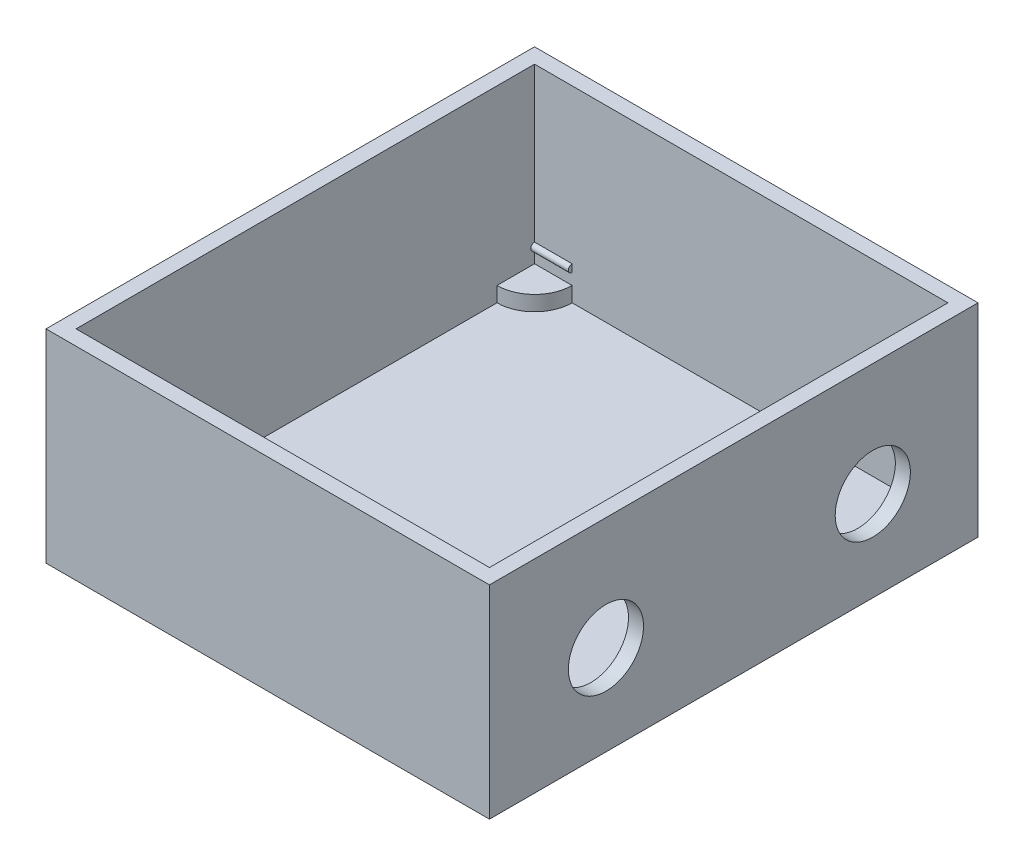
ISO-10303-21;
HEADER;
FILE_DESCRIPTION(('STEP AP214'),'2;1');
FILE_NAME('part.step','',(''),(''),'','','');
FILE_SCHEMA(('AUTOMOTIVE_DESIGN { 1 0 10303 214 1 1 1 1 }'));
ENDSEC;
DATA;
#1=APPLICATION_CONTEXT('core data for automotive mechanical design processes');
#2=APPLICATION_PROTOCOL_DEFINITION('international standard','automotive_design',2000,#1);
#3=PRODUCT_CONTEXT('',#1,'mechanical');
#4=PRODUCT('Part','Part','',(#3));
#5=PRODUCT_RELATED_PRODUCT_CATEGORY('part','',(#4));
#6=PRODUCT_DEFINITION_FORMATION('','',#4);
#7=PRODUCT_DEFINITION_CONTEXT('part definition',#1,'design');
#8=PRODUCT_DEFINITION('design','',#6,#7);
#9=PRODUCT_DEFINITION_SHAPE('','',#8);
#10=(LENGTH_UNIT() NAMED_UNIT(*) SI_UNIT(.MILLI.,.METRE.));
#11=(NAMED_UNIT(*) PLANE_ANGLE_UNIT() SI_UNIT($,.RADIAN.));
#12=(NAMED_UNIT(*) SI_UNIT($,.STERADIAN.) SOLID_ANGLE_UNIT());
#13=UNCERTAINTY_MEASURE_WITH_UNIT(LENGTH_MEASURE(1.E-05),#10,'distance_accuracy_value','');
#14=(GEOMETRIC_REPRESENTATION_CONTEXT(3) GLOBAL_UNCERTAINTY_ASSIGNED_CONTEXT((#13)) GLOBAL_UNIT_ASSIGNED_CONTEXT((#10,
#11,#12)) REPRESENTATION_CONTEXT('',''));
#15=CARTESIAN_POINT('',(0.,0.,0.));
#16=DIRECTION('',(0.,0.,1.));
#17=DIRECTION('',(1.,0.,0.));
#18=AXIS2_PLACEMENT_3D('',#15,#16,#17);
#19=CARTESIAN_POINT('',(-27.5,25.,-30.5));
#20=DIRECTION('',(0.,0.,1.));
#21=DIRECTION('',(1.,0.,0.));
#22=AXIS2_PLACEMENT_3D('',#19,#20,#21);
#23=PLANE('',#22);
#24=DIRECTION('',(0.,-1.,0.));
#25=VECTOR('',#24,1.);
#26=CARTESIAN_POINT('',(27.5,25.,-30.5));
#27=LINE('',#26,#25);
#28=CARTESIAN_POINT('',(27.5,3.5,-30.5));
#29=VERTEX_POINT('',#28);
#30=CARTESIAN_POINT('',(27.5,2.,-30.5));
#31=VERTEX_POINT('',#30);
#32=EDGE_CURVE('E206',#29,#31,#27,.T.);
#33=ORIENTED_EDGE('',*,*,#32,.F.);
#34=DIRECTION('',(1.,0.,0.));
#35=VECTOR('',#34,1.);
#36=CARTESIAN_POINT('',(27.5,3.5,-30.5));
#37=LINE('',#36,#35);
#38=CARTESIAN_POINT('',(22.5,3.5,-30.5));
#39=VERTEX_POINT('',#38);
#40=EDGE_CURVE('E48',#39,#29,#37,.T.);
#41=ORIENTED_EDGE('',*,*,#40,.F.);
#42=DIRECTION('',(0.,1.,0.));
#43=VECTOR('',#42,1.);
#44=CARTESIAN_POINT('',(22.5,4.,-30.5));
#45=LINE('',#44,#43);
#46=CARTESIAN_POINT('',(22.5,4.5,-30.5));
#47=VERTEX_POINT('',#46);
#48=EDGE_CURVE('E193',#39,#47,#45,.T.);
#49=ORIENTED_EDGE('',*,*,#48,.T.);
#50=DIRECTION('',(1.,0.,0.));
#51=VECTOR('',#50,1.);
#52=CARTESIAN_POINT('',(27.5,4.5,-30.5));
#53=LINE('',#52,#51);
#54=CARTESIAN_POINT('',(27.5,4.5,-30.5));
#55=VERTEX_POINT('',#54);
#56=EDGE_CURVE('E199',#47,#55,#53,.T.);
#57=ORIENTED_EDGE('',*,*,#56,.T.);
#58=CARTESIAN_POINT('',(27.5,25.,-30.5));
#59=VERTEX_POINT('',#58);
#60=EDGE_CURVE('E359',#59,#55,#27,.T.);
#61=ORIENTED_EDGE('',*,*,#60,.F.);
#62=DIRECTION('',(-1.,0.,0.));
#63=VECTOR('',#62,1.);
#64=CARTESIAN_POINT('',(-27.5,25.,-30.5));
#65=LINE('',#64,#63);
#66=CARTESIAN_POINT('',(-27.5,25.,-30.5));
#67=VERTEX_POINT('',#66);
#68=EDGE_CURVE('E339',#59,#67,#65,.T.);
#69=ORIENTED_EDGE('',*,*,#68,.T.);
#70=DIRECTION('',(0.,-1.,0.));
#71=VECTOR('',#70,1.);
#72=CARTESIAN_POINT('',(-27.5,25.,-30.5));
#73=LINE('',#72,#71);
#74=CARTESIAN_POINT('',(-27.5,4.5,-30.5));
#75=VERTEX_POINT('',#74);
#76=EDGE_CURVE('E356',#67,#75,#73,.T.);
#77=ORIENTED_EDGE('',*,*,#76,.T.);
#78=DIRECTION('',(1.,0.,0.));
#79=VECTOR('',#78,1.);
#80=CARTESIAN_POINT('',(-27.5,4.5,-30.5));
#81=LINE('',#80,#79);
#82=CARTESIAN_POINT('',(-22.5,4.5,-30.5));
#83=VERTEX_POINT('',#82);
#84=EDGE_CURVE('E212',#75,#83,#81,.T.);
#85=ORIENTED_EDGE('',*,*,#84,.T.);
#86=DIRECTION('',(0.,-1.,0.));
#87=VECTOR('',#86,1.);
#88=CARTESIAN_POINT('',(-22.5,4.,-30.5));
#89=LINE('',#88,#87);
#90=CARTESIAN_POINT('',(-22.5,3.5,-30.5));
#91=VERTEX_POINT('',#90);
#92=EDGE_CURVE('E215',#83,#91,#89,.T.);
#93=ORIENTED_EDGE('',*,*,#92,.T.);
#94=DIRECTION('',(1.,0.,0.));
#95=VECTOR('',#94,1.);
#96=CARTESIAN_POINT('',(-27.5,3.5,-30.5));
#97=LINE('',#96,#95);
#98=CARTESIAN_POINT('',(-27.5,3.5,-30.5));
#99=VERTEX_POINT('',#98);
#100=EDGE_CURVE('E56',#99,#91,#97,.T.);
#101=ORIENTED_EDGE('',*,*,#100,.F.);
#102=CARTESIAN_POINT('',(-27.5,2.,-30.5));
#103=VERTEX_POINT('',#102);
#104=EDGE_CURVE('E355',#99,#103,#73,.T.);
#105=ORIENTED_EDGE('',*,*,#104,.T.);
#106=DIRECTION('',(-1.,0.,0.));
#107=VECTOR('',#106,1.);
#108=CARTESIAN_POINT('',(-27.5,2.,-30.5));
#109=LINE('',#108,#107);
#110=CARTESIAN_POINT('',(-22.5,2.,-30.5));
#111=VERTEX_POINT('',#110);
#112=EDGE_CURVE('E307',#111,#103,#109,.T.);
#113=ORIENTED_EDGE('',*,*,#112,.F.);
#114=DIRECTION('',(0.,-1.,0.));
#115=VECTOR('',#114,1.);
#116=CARTESIAN_POINT('',(-22.5,2.,-30.5));
#117=LINE('',#116,#115);
#118=CARTESIAN_POINT('',(-22.5,0.,-30.5));
#119=VERTEX_POINT('',#118);
#120=EDGE_CURVE('E314',#111,#119,#117,.T.);
#121=ORIENTED_EDGE('',*,*,#120,.T.);
#122=DIRECTION('',(-1.,0.,0.));
#123=VECTOR('',#122,1.);
#124=CARTESIAN_POINT('',(-27.5,0.,-30.5));
#125=LINE('',#124,#123);
#126=CARTESIAN_POINT('',(22.5,0.,-30.5));
#127=VERTEX_POINT('',#126);
#128=EDGE_CURVE('E348',#127,#119,#125,.T.);
#129=ORIENTED_EDGE('',*,*,#128,.F.);
#130=DIRECTION('',(0.,-1.,0.));
#131=VECTOR('',#130,1.);
#132=CARTESIAN_POINT('',(22.5,2.,-30.5));
#133=LINE('',#132,#131);
#134=CARTESIAN_POINT('',(22.5,2.,-30.5));
#135=VERTEX_POINT('',#134);
#136=EDGE_CURVE('E304',#135,#127,#133,.T.);
#137=ORIENTED_EDGE('',*,*,#136,.F.);
#138=DIRECTION('',(-1.,0.,0.));
#139=VECTOR('',#138,1.);
#140=CARTESIAN_POINT('',(27.5,2.,-30.5));
#141=LINE('',#140,#139);
#142=EDGE_CURVE('E295',#31,#135,#141,.T.);
#143=ORIENTED_EDGE('',*,*,#142,.F.);
#144=EDGE_LOOP('',(#33,#41,#49,#57,#61,#69,#77,#85,#93,#101,#105,#113,#121,#129,#137,#143));
#145=FACE_BOUND('',#144,.T.);
#146=ADVANCED_FACE('F33',(#145),#23,.T.);
#147=CARTESIAN_POINT('',(27.5,25.,30.5));
#148=DIRECTION('',(-1.,0.,0.));
#149=DIRECTION('',(0.,0.,1.));
#150=AXIS2_PLACEMENT_3D('',#147,#148,#149);
#151=PLANE('',#150);
#152=CARTESIAN_POINT('',(27.5,10.,-18.5));
#153=DIRECTION('',(-1.,0.,0.));
#154=DIRECTION('',(0.,0.,1.));
#155=AXIS2_PLACEMENT_3D('',#152,#153,#154);
#156=CIRCLE('',#155,5.);
#157=CARTESIAN_POINT('',(27.5,10.,-13.5));
#158=VERTEX_POINT('',#157);
#159=EDGE_CURVE('E249',#158,#158,#156,.T.);
#160=ORIENTED_EDGE('',*,*,#159,.F.);
#161=EDGE_LOOP('',(#160));
#162=FACE_BOUND('',#161,.T.);
#163=CARTESIAN_POINT('',(27.5,10.,17.));
#164=DIRECTION('',(-1.,0.,0.));
#165=DIRECTION('',(0.,0.,1.));
#166=AXIS2_PLACEMENT_3D('',#163,#164,#165);
#167=CIRCLE('',#166,5.);
#168=CARTESIAN_POINT('',(27.5,10.,22.));
#169=VERTEX_POINT('',#168);
#170=EDGE_CURVE('E253',#169,#169,#167,.T.);
#171=ORIENTED_EDGE('',*,*,#170,.F.);
#172=EDGE_LOOP('',(#171));
#173=FACE_BOUND('',#172,.T.);
#174=ORIENTED_EDGE('',*,*,#60,.T.);
#175=CARTESIAN_POINT('',(27.5,4.,-30.5));
#176=DIRECTION('',(1.,0.,0.));
#177=DIRECTION('',(0.,0.,-1.));
#178=AXIS2_PLACEMENT_3D('',#175,#176,#177);
#179=CIRCLE('',#178,0.5);
#180=EDGE_CURVE('E202',#55,#29,#179,.T.);
#181=ORIENTED_EDGE('',*,*,#180,.T.);
#182=ORIENTED_EDGE('',*,*,#32,.T.);
#183=DIRECTION('',(0.,0.,-1.));
#184=VECTOR('',#183,1.);
#185=CARTESIAN_POINT('',(27.5,2.,-25.5));
#186=LINE('',#185,#184);
#187=CARTESIAN_POINT('',(27.5,2.,-25.5));
#188=VERTEX_POINT('',#187);
#189=EDGE_CURVE('E292',#188,#31,#186,.T.);
#190=ORIENTED_EDGE('',*,*,#189,.F.);
#191=DIRECTION('',(0.,-1.,0.));
#192=VECTOR('',#191,1.);
#193=CARTESIAN_POINT('',(27.5,2.,-25.5));
#194=LINE('',#193,#192);
#195=CARTESIAN_POINT('',(27.5,0.,-25.5));
#196=VERTEX_POINT('',#195);
#197=EDGE_CURVE('E299',#188,#196,#194,.T.);
#198=ORIENTED_EDGE('',*,*,#197,.T.);
#199=DIRECTION('',(0.,0.,-1.));
#200=VECTOR('',#199,1.);
#201=CARTESIAN_POINT('',(27.5,0.,30.5));
#202=LINE('',#201,#200);
#203=CARTESIAN_POINT('',(27.5,0.,25.5));
#204=VERTEX_POINT('',#203);
#205=EDGE_CURVE('E346',#204,#196,#202,.T.);
#206=ORIENTED_EDGE('',*,*,#205,.F.);
#207=DIRECTION('',(0.,-1.,0.));
#208=VECTOR('',#207,1.);
#209=CARTESIAN_POINT('',(27.5,2.,25.5));
#210=LINE('',#209,#208);
#211=CARTESIAN_POINT('',(27.5,2.,25.5));
#212=VERTEX_POINT('',#211);
#213=EDGE_CURVE('E284',#212,#204,#210,.T.);
#214=ORIENTED_EDGE('',*,*,#213,.F.);
#215=DIRECTION('',(0.,0.,-1.));
#216=VECTOR('',#215,1.);
#217=CARTESIAN_POINT('',(27.5,2.,25.5));
#218=LINE('',#217,#216);
#219=CARTESIAN_POINT('',(27.5,2.,30.5));
#220=VERTEX_POINT('',#219);
#221=EDGE_CURVE('E282',#220,#212,#218,.T.);
#222=ORIENTED_EDGE('',*,*,#221,.F.);
#223=DIRECTION('',(0.,-1.,0.));
#224=VECTOR('',#223,1.);
#225=CARTESIAN_POINT('',(27.5,25.,30.5));
#226=LINE('',#225,#224);
#227=CARTESIAN_POINT('',(27.5,3.5,30.5));
#228=VERTEX_POINT('',#227);
#229=EDGE_CURVE('E362',#228,#220,#226,.T.);
#230=ORIENTED_EDGE('',*,*,#229,.F.);
#231=CARTESIAN_POINT('',(27.5,4.,30.5));
#232=DIRECTION('',(-1.,0.,0.));
#233=DIRECTION('',(0.,0.,1.));
#234=AXIS2_PLACEMENT_3D('',#231,#232,#233);
#235=CIRCLE('',#234,0.5);
#236=CARTESIAN_POINT('',(27.5,4.5,30.5));
#237=VERTEX_POINT('',#236);
#238=EDGE_CURVE('E247',#237,#228,#235,.T.);
#239=ORIENTED_EDGE('',*,*,#238,.F.);
#240=CARTESIAN_POINT('',(27.5,25.,30.5));
#241=VERTEX_POINT('',#240);
#242=EDGE_CURVE('E363',#241,#237,#226,.T.);
#243=ORIENTED_EDGE('',*,*,#242,.F.);
#244=DIRECTION('',(0.,0.,-1.));
#245=VECTOR('',#244,1.);
#246=CARTESIAN_POINT('',(27.5,25.,30.5));
#247=LINE('',#246,#245);
#248=EDGE_CURVE('E336',#241,#59,#247,.T.);
#249=ORIENTED_EDGE('',*,*,#248,.T.);
#250=EDGE_LOOP('',(#174,#181,#182,#190,#198,#206,#214,#222,#230,#239,#243,#249));
#251=FACE_BOUND('',#250,.T.);
#252=ADVANCED_FACE('F411',(#162,#173,#251),#151,.T.);
#253=CARTESIAN_POINT('',(-27.5,25.,30.5));
#254=DIRECTION('',(1.,0.,0.));
#255=DIRECTION('',(0.,0.,-1.));
#256=AXIS2_PLACEMENT_3D('',#253,#254,#255);
#257=PLANE('',#256);
#258=ORIENTED_EDGE('',*,*,#104,.F.);
#259=CARTESIAN_POINT('',(-27.5,4.,-30.5));
#260=DIRECTION('',(1.,0.,0.));
#261=DIRECTION('',(0.,0.,-1.));
#262=AXIS2_PLACEMENT_3D('',#259,#260,#261);
#263=CIRCLE('',#262,0.5);
#264=EDGE_CURVE('E220',#75,#99,#263,.T.);
#265=ORIENTED_EDGE('',*,*,#264,.F.);
#266=ORIENTED_EDGE('',*,*,#76,.F.);
#267=DIRECTION('',(0.,0.,1.));
#268=VECTOR('',#267,1.);
#269=CARTESIAN_POINT('',(-27.5,25.,30.5));
#270=LINE('',#269,#268);
#271=CARTESIAN_POINT('',(-27.5,25.,30.5));
#272=VERTEX_POINT('',#271);
#273=EDGE_CURVE('E342',#67,#272,#270,.T.);
#274=ORIENTED_EDGE('',*,*,#273,.T.);
#275=DIRECTION('',(0.,-1.,0.));
#276=VECTOR('',#275,1.);
#277=CARTESIAN_POINT('',(-27.5,25.,30.5));
#278=LINE('',#277,#276);
#279=CARTESIAN_POINT('',(-27.5,4.5,30.5));
#280=VERTEX_POINT('',#279);
#281=EDGE_CURVE('E352',#272,#280,#278,.T.);
#282=ORIENTED_EDGE('',*,*,#281,.T.);
#283=CARTESIAN_POINT('',(-27.5,4.,30.5));
#284=DIRECTION('',(-1.,0.,0.));
#285=DIRECTION('',(0.,0.,1.));
#286=AXIS2_PLACEMENT_3D('',#283,#284,#285);
#287=CIRCLE('',#286,0.5);
#288=CARTESIAN_POINT('',(-27.5,3.5,30.5));
#289=VERTEX_POINT('',#288);
#290=EDGE_CURVE('E233',#280,#289,#287,.T.);
#291=ORIENTED_EDGE('',*,*,#290,.T.);
#292=CARTESIAN_POINT('',(-27.5,2.,30.5));
#293=VERTEX_POINT('',#292);
#294=EDGE_CURVE('E344',#289,#293,#278,.T.);
#295=ORIENTED_EDGE('',*,*,#294,.T.);
#296=DIRECTION('',(0.,0.,1.));
#297=VECTOR('',#296,1.);
#298=CARTESIAN_POINT('',(-27.5,2.,25.5));
#299=LINE('',#298,#297);
#300=CARTESIAN_POINT('',(-27.5,2.,25.5));
#301=VERTEX_POINT('',#300);
#302=EDGE_CURVE('E265',#301,#293,#299,.T.);
#303=ORIENTED_EDGE('',*,*,#302,.F.);
#304=DIRECTION('',(0.,-1.,0.));
#305=VECTOR('',#304,1.);
#306=CARTESIAN_POINT('',(-27.5,2.,25.5));
#307=LINE('',#306,#305);
#308=CARTESIAN_POINT('',(-27.5,0.,25.5));
#309=VERTEX_POINT('',#308);
#310=EDGE_CURVE('E273',#301,#309,#307,.T.);
#311=ORIENTED_EDGE('',*,*,#310,.T.);
#312=DIRECTION('',(0.,0.,1.));
#313=VECTOR('',#312,1.);
#314=CARTESIAN_POINT('',(-27.5,0.,30.5));
#315=LINE('',#314,#313);
#316=CARTESIAN_POINT('',(-27.5,0.,-25.5));
#317=VERTEX_POINT('',#316);
#318=EDGE_CURVE('E337',#317,#309,#315,.T.);
#319=ORIENTED_EDGE('',*,*,#318,.F.);
#320=DIRECTION('',(0.,-1.,0.));
#321=VECTOR('',#320,1.);
#322=CARTESIAN_POINT('',(-27.5,2.,-25.5));
#323=LINE('',#322,#321);
#324=CARTESIAN_POINT('',(-27.5,2.,-25.5));
#325=VERTEX_POINT('',#324);
#326=EDGE_CURVE('E319',#325,#317,#323,.T.);
#327=ORIENTED_EDGE('',*,*,#326,.F.);
#328=DIRECTION('',(0.,0.,1.));
#329=VECTOR('',#328,1.);
#330=CARTESIAN_POINT('',(-27.5,2.,-25.5));
#331=LINE('',#330,#329);
#332=EDGE_CURVE('E310',#103,#325,#331,.T.);
#333=ORIENTED_EDGE('',*,*,#332,.F.);
#334=EDGE_LOOP('',(#258,#265,#266,#274,#282,#291,#295,#303,#311,#319,#327,#333));
#335=FACE_BOUND('',#334,.T.);
#336=ADVANCED_FACE('F416',(#335),#257,.T.);
#337=CARTESIAN_POINT('',(-27.5,25.,30.5));
#338=DIRECTION('',(0.,0.,-1.));
#339=DIRECTION('',(-1.,0.,0.));
#340=AXIS2_PLACEMENT_3D('',#337,#338,#339);
#341=PLANE('',#340);
#342=ORIENTED_EDGE('',*,*,#294,.F.);
#343=DIRECTION('',(-1.,0.,0.));
#344=VECTOR('',#343,1.);
#345=CARTESIAN_POINT('',(-27.5,3.5,30.5));
#346=LINE('',#345,#344);
#347=CARTESIAN_POINT('',(-22.5,3.5,30.5));
#348=VERTEX_POINT('',#347);
#349=EDGE_CURVE('E222',#348,#289,#346,.T.);
#350=ORIENTED_EDGE('',*,*,#349,.F.);
#351=DIRECTION('',(0.,1.,0.));
#352=VECTOR('',#351,1.);
#353=CARTESIAN_POINT('',(-22.5,4.,30.5));
#354=LINE('',#353,#352);
#355=CARTESIAN_POINT('',(-22.5,4.5,30.5));
#356=VERTEX_POINT('',#355);
#357=EDGE_CURVE('E224',#348,#356,#354,.T.);
#358=ORIENTED_EDGE('',*,*,#357,.T.);
#359=DIRECTION('',(-1.,0.,0.));
#360=VECTOR('',#359,1.);
#361=CARTESIAN_POINT('',(-27.5,4.5,30.5));
#362=LINE('',#361,#360);
#363=EDGE_CURVE('E227',#356,#280,#362,.T.);
#364=ORIENTED_EDGE('',*,*,#363,.T.);
#365=ORIENTED_EDGE('',*,*,#281,.F.);
#366=DIRECTION('',(1.,0.,0.));
#367=VECTOR('',#366,1.);
#368=CARTESIAN_POINT('',(-27.5,25.,30.5));
#369=LINE('',#368,#367);
#370=EDGE_CURVE('E334',#272,#241,#369,.T.);
#371=ORIENTED_EDGE('',*,*,#370,.T.);
#372=ORIENTED_EDGE('',*,*,#242,.T.);
#373=DIRECTION('',(-1.,0.,0.));
#374=VECTOR('',#373,1.);
#375=CARTESIAN_POINT('',(27.5,4.5,30.5));
#376=LINE('',#375,#374);
#377=CARTESIAN_POINT('',(22.5,4.5,30.5));
#378=VERTEX_POINT('',#377);
#379=EDGE_CURVE('E239',#237,#378,#376,.T.);
#380=ORIENTED_EDGE('',*,*,#379,.T.);
#381=DIRECTION('',(0.,-1.,0.));
#382=VECTOR('',#381,1.);
#383=CARTESIAN_POINT('',(22.5,4.,30.5));
#384=LINE('',#383,#382);
#385=CARTESIAN_POINT('',(22.5,3.5,30.5));
#386=VERTEX_POINT('',#385);
#387=EDGE_CURVE('E242',#378,#386,#384,.T.);
#388=ORIENTED_EDGE('',*,*,#387,.T.);
#389=DIRECTION('',(-1.,0.,0.));
#390=VECTOR('',#389,1.);
#391=CARTESIAN_POINT('',(27.5,3.5,30.5));
#392=LINE('',#391,#390);
#393=EDGE_CURVE('E236',#228,#386,#392,.T.);
#394=ORIENTED_EDGE('',*,*,#393,.F.);
#395=ORIENTED_EDGE('',*,*,#229,.T.);
#396=DIRECTION('',(1.,0.,0.));
#397=VECTOR('',#396,1.);
#398=CARTESIAN_POINT('',(27.5,2.,30.5));
#399=LINE('',#398,#397);
#400=CARTESIAN_POINT('',(22.5,2.,30.5));
#401=VERTEX_POINT('',#400);
#402=EDGE_CURVE('E279',#401,#220,#399,.T.);
#403=ORIENTED_EDGE('',*,*,#402,.F.);
#404=DIRECTION('',(0.,-1.,0.));
#405=VECTOR('',#404,1.);
#406=CARTESIAN_POINT('',(22.5,2.,30.5));
#407=LINE('',#406,#405);
#408=CARTESIAN_POINT('',(22.5,0.,30.5));
#409=VERTEX_POINT('',#408);
#410=EDGE_CURVE('E288',#401,#409,#407,.T.);
#411=ORIENTED_EDGE('',*,*,#410,.T.);
#412=DIRECTION('',(1.,0.,0.));
#413=VECTOR('',#412,1.);
#414=CARTESIAN_POINT('',(-27.5,0.,30.5));
#415=LINE('',#414,#413);
#416=CARTESIAN_POINT('',(-22.5,0.,30.5));
#417=VERTEX_POINT('',#416);
#418=EDGE_CURVE('E333',#417,#409,#415,.T.);
#419=ORIENTED_EDGE('',*,*,#418,.F.);
#420=DIRECTION('',(0.,-1.,0.));
#421=VECTOR('',#420,1.);
#422=CARTESIAN_POINT('',(-22.5,2.,30.5));
#423=LINE('',#422,#421);
#424=CARTESIAN_POINT('',(-22.5,2.,30.5));
#425=VERTEX_POINT('',#424);
#426=EDGE_CURVE('E270',#425,#417,#423,.T.);
#427=ORIENTED_EDGE('',*,*,#426,.F.);
#428=DIRECTION('',(1.,0.,0.));
#429=VECTOR('',#428,1.);
#430=CARTESIAN_POINT('',(-27.5,2.,30.5));
#431=LINE('',#430,#429);
#432=EDGE_CURVE('E268',#293,#425,#431,.T.);
#433=ORIENTED_EDGE('',*,*,#432,.F.);
#434=EDGE_LOOP('',(#342,#350,#358,#364,#365,#371,#372,#380,#388,#394,#395,#403,#411,#419,#427,#433));
#435=FACE_BOUND('',#434,.T.);
#436=ADVANCED_FACE('F420',(#435),#341,.T.);
#437=CARTESIAN_POINT('',(0.,0.,0.));
#438=DIRECTION('',(0.,1.,0.));
#439=DIRECTION('',(0.,0.,1.));
#440=AXIS2_PLACEMENT_3D('',#437,#438,#439);
#441=PLANE('',#440);
#442=ORIENTED_EDGE('',*,*,#318,.T.);
#443=CARTESIAN_POINT('',(-27.5,0.,30.5));
#444=DIRECTION('',(0.,1.,0.));
#445=DIRECTION('',(0.,0.,-1.));
#446=AXIS2_PLACEMENT_3D('',#443,#444,#445);
#447=CIRCLE('',#446,5.);
#448=EDGE_CURVE('E259',#417,#309,#447,.T.);
#449=ORIENTED_EDGE('',*,*,#448,.F.);
#450=ORIENTED_EDGE('',*,*,#418,.T.);
#451=CARTESIAN_POINT('',(27.5,0.,30.5));
#452=DIRECTION('',(0.,1.,0.));
#453=DIRECTION('',(0.,0.,1.));
#454=AXIS2_PLACEMENT_3D('',#451,#452,#453);
#455=CIRCLE('',#454,5.);
#456=EDGE_CURVE('E276',#204,#409,#455,.T.);
#457=ORIENTED_EDGE('',*,*,#456,.F.);
#458=ORIENTED_EDGE('',*,*,#205,.T.);
#459=CARTESIAN_POINT('',(27.5,0.,-30.5));
#460=DIRECTION('',(0.,1.,0.));
#461=DIRECTION('',(0.,0.,-1.));
#462=AXIS2_PLACEMENT_3D('',#459,#460,#461);
#463=CIRCLE('',#462,5.);
#464=EDGE_CURVE('E291',#127,#196,#463,.T.);
#465=ORIENTED_EDGE('',*,*,#464,.F.);
#466=ORIENTED_EDGE('',*,*,#128,.T.);
#467=CARTESIAN_POINT('',(-27.5,0.,-30.5));
#468=DIRECTION('',(0.,1.,0.));
#469=DIRECTION('',(0.,0.,1.));
#470=AXIS2_PLACEMENT_3D('',#467,#468,#469);
#471=CIRCLE('',#470,5.);
#472=EDGE_CURVE('E306',#317,#119,#471,.T.);
#473=ORIENTED_EDGE('',*,*,#472,.F.);
#474=EDGE_LOOP('',(#442,#449,#450,#457,#458,#465,#466,#473));
#475=FACE_BOUND('',#474,.T.);
#476=ADVANCED_FACE('F402',(#475),#441,.T.);
#477=CARTESIAN_POINT('',(0.,25.,0.));
#478=DIRECTION('',(0.,1.,0.));
#479=DIRECTION('',(0.,0.,1.));
#480=AXIS2_PLACEMENT_3D('',#477,#478,#479);
#481=PLANE('',#480);
#482=DIRECTION('',(1.,0.,0.));
#483=VECTOR('',#482,1.);
#484=CARTESIAN_POINT('',(-29.5,25.,32.5));
#485=LINE('',#484,#483);
#486=CARTESIAN_POINT('',(-29.5,25.,32.5));
#487=VERTEX_POINT('',#486);
#488=CARTESIAN_POINT('',(29.5,25.,32.5));
#489=VERTEX_POINT('',#488);
#490=EDGE_CURVE('E366',#487,#489,#485,.T.);
#491=ORIENTED_EDGE('',*,*,#490,.T.);
#492=DIRECTION('',(0.,0.,-1.));
#493=VECTOR('',#492,1.);
#494=CARTESIAN_POINT('',(29.5,25.,32.5));
#495=LINE('',#494,#493);
#496=CARTESIAN_POINT('',(29.5,25.,-32.5));
#497=VERTEX_POINT('',#496);
#498=EDGE_CURVE('E369',#489,#497,#495,.T.);
#499=ORIENTED_EDGE('',*,*,#498,.T.);
#500=DIRECTION('',(-1.,0.,0.));
#501=VECTOR('',#500,1.);
#502=CARTESIAN_POINT('',(-29.5,25.,-32.5));
#503=LINE('',#502,#501);
#504=CARTESIAN_POINT('',(-29.5,25.,-32.5));
#505=VERTEX_POINT('',#504);
#506=EDGE_CURVE('E371',#497,#505,#503,.T.);
#507=ORIENTED_EDGE('',*,*,#506,.T.);
#508=DIRECTION('',(0.,0.,1.));
#509=VECTOR('',#508,1.);
#510=CARTESIAN_POINT('',(-29.5,25.,32.5));
#511=LINE('',#510,#509);
#512=EDGE_CURVE('E373',#505,#487,#511,.T.);
#513=ORIENTED_EDGE('',*,*,#512,.T.);
#514=EDGE_LOOP('',(#491,#499,#507,#513));
#515=FACE_BOUND('',#514,.T.);
#516=ORIENTED_EDGE('',*,*,#248,.F.);
#517=ORIENTED_EDGE('',*,*,#370,.F.);
#518=ORIENTED_EDGE('',*,*,#273,.F.);
#519=ORIENTED_EDGE('',*,*,#68,.F.);
#520=EDGE_LOOP('',(#516,#517,#518,#519));
#521=FACE_BOUND('',#520,.T.);
#522=ADVANCED_FACE('F399',(#515,#521),#481,.T.);
#523=CARTESIAN_POINT('',(-29.5,25.,32.5));
#524=DIRECTION('',(0.,0.,-1.));
#525=DIRECTION('',(-1.,0.,0.));
#526=AXIS2_PLACEMENT_3D('',#523,#524,#525);
#527=PLANE('',#526);
#528=DIRECTION('',(0.,-1.,0.));
#529=VECTOR('',#528,1.);
#530=CARTESIAN_POINT('',(-29.5,25.,32.5));
#531=LINE('',#530,#529);
#532=CARTESIAN_POINT('',(-29.5,-2.,32.5));
#533=VERTEX_POINT('',#532);
#534=EDGE_CURVE('E375',#487,#533,#531,.T.);
#535=ORIENTED_EDGE('',*,*,#534,.T.);
#536=DIRECTION('',(-1.,0.,0.));
#537=VECTOR('',#536,1.);
#538=CARTESIAN_POINT('',(29.5,-2.,32.5));
#539=LINE('',#538,#537);
#540=CARTESIAN_POINT('',(29.5,-2.,32.5));
#541=VERTEX_POINT('',#540);
#542=EDGE_CURVE('E330',#541,#533,#539,.T.);
#543=ORIENTED_EDGE('',*,*,#542,.F.);
#544=DIRECTION('',(0.,-1.,0.));
#545=VECTOR('',#544,1.);
#546=CARTESIAN_POINT('',(29.5,25.,32.5));
#547=LINE('',#546,#545);
#548=EDGE_CURVE('E11',#489,#541,#547,.T.);
#549=ORIENTED_EDGE('',*,*,#548,.F.);
#550=ORIENTED_EDGE('',*,*,#490,.F.);
#551=EDGE_LOOP('',(#535,#543,#549,#550));
#552=FACE_BOUND('',#551,.T.);
#553=ADVANCED_FACE('F35',(#552),#527,.F.);
#554=CARTESIAN_POINT('',(29.5,25.,32.5));
#555=DIRECTION('',(-1.,0.,0.));
#556=DIRECTION('',(0.,0.,1.));
#557=AXIS2_PLACEMENT_3D('',#554,#555,#556);
#558=PLANE('',#557);
#559=CARTESIAN_POINT('',(29.5,10.,-18.5));
#560=DIRECTION('',(-1.,0.,0.));
#561=DIRECTION('',(0.,0.,1.));
#562=AXIS2_PLACEMENT_3D('',#559,#560,#561);
#563=CIRCLE('',#562,5.);
#564=CARTESIAN_POINT('',(29.5,10.,-13.5));
#565=VERTEX_POINT('',#564);
#566=EDGE_CURVE('E250',#565,#565,#563,.T.);
#567=ORIENTED_EDGE('',*,*,#566,.T.);
#568=EDGE_LOOP('',(#567));
#569=FACE_BOUND('',#568,.T.);
#570=CARTESIAN_POINT('',(29.5,10.,17.));
#571=DIRECTION('',(-1.,0.,0.));
#572=DIRECTION('',(0.,0.,1.));
#573=AXIS2_PLACEMENT_3D('',#570,#571,#572);
#574=CIRCLE('',#573,5.);
#575=CARTESIAN_POINT('',(29.5,10.,22.));
#576=VERTEX_POINT('',#575);
#577=EDGE_CURVE('E256',#576,#576,#574,.T.);
#578=ORIENTED_EDGE('',*,*,#577,.T.);
#579=EDGE_LOOP('',(#578));
#580=FACE_BOUND('',#579,.T.);
#581=ORIENTED_EDGE('',*,*,#548,.T.);
#582=DIRECTION('',(0.,0.,1.));
#583=VECTOR('',#582,1.);
#584=CARTESIAN_POINT('',(29.5,-2.,32.5));
#585=LINE('',#584,#583);
#586=CARTESIAN_POINT('',(29.5,-2.,-32.5));
#587=VERTEX_POINT('',#586);
#588=EDGE_CURVE('E327',#587,#541,#585,.T.);
#589=ORIENTED_EDGE('',*,*,#588,.F.);
#590=DIRECTION('',(0.,-1.,0.));
#591=VECTOR('',#590,1.);
#592=CARTESIAN_POINT('',(29.5,25.,-32.5));
#593=LINE('',#592,#591);
#594=EDGE_CURVE('E41',#497,#587,#593,.T.);
#595=ORIENTED_EDGE('',*,*,#594,.F.);
#596=ORIENTED_EDGE('',*,*,#498,.F.);
#597=EDGE_LOOP('',(#581,#589,#595,#596));
#598=FACE_BOUND('',#597,.T.);
#599=ADVANCED_FACE('F390',(#569,#580,#598),#558,.F.);
#600=CARTESIAN_POINT('',(-29.5,25.,-32.5));
#601=DIRECTION('',(0.,0.,1.));
#602=DIRECTION('',(1.,0.,0.));
#603=AXIS2_PLACEMENT_3D('',#600,#601,#602);
#604=PLANE('',#603);
#605=ORIENTED_EDGE('',*,*,#594,.T.);
#606=DIRECTION('',(1.,0.,0.));
#607=VECTOR('',#606,1.);
#608=CARTESIAN_POINT('',(29.5,-2.,-32.5));
#609=LINE('',#608,#607);
#610=CARTESIAN_POINT('',(-29.5,-2.,-32.5));
#611=VERTEX_POINT('',#610);
#612=EDGE_CURVE('E324',#611,#587,#609,.T.);
#613=ORIENTED_EDGE('',*,*,#612,.F.);
#614=DIRECTION('',(0.,-1.,0.));
#615=VECTOR('',#614,1.);
#616=CARTESIAN_POINT('',(-29.5,25.,-32.5));
#617=LINE('',#616,#615);
#618=EDGE_CURVE('E377',#505,#611,#617,.T.);
#619=ORIENTED_EDGE('',*,*,#618,.F.);
#620=ORIENTED_EDGE('',*,*,#506,.F.);
#621=EDGE_LOOP('',(#605,#613,#619,#620));
#622=FACE_BOUND('',#621,.T.);
#623=ADVANCED_FACE('F382',(#622),#604,.F.);
#624=CARTESIAN_POINT('',(-29.5,25.,32.5));
#625=DIRECTION('',(1.,0.,0.));
#626=DIRECTION('',(0.,0.,-1.));
#627=AXIS2_PLACEMENT_3D('',#624,#625,#626);
#628=PLANE('',#627);
#629=ORIENTED_EDGE('',*,*,#618,.T.);
#630=DIRECTION('',(0.,0.,-1.));
#631=VECTOR('',#630,1.);
#632=CARTESIAN_POINT('',(-29.5,-2.,32.5));
#633=LINE('',#632,#631);
#634=EDGE_CURVE('E321',#533,#611,#633,.T.);
#635=ORIENTED_EDGE('',*,*,#634,.F.);
#636=ORIENTED_EDGE('',*,*,#534,.F.);
#637=ORIENTED_EDGE('',*,*,#512,.F.);
#638=EDGE_LOOP('',(#629,#635,#636,#637));
#639=FACE_BOUND('',#638,.T.);
#640=ADVANCED_FACE('F396',(#639),#628,.F.);
#641=CARTESIAN_POINT('',(0.,-2.,0.));
#642=DIRECTION('',(0.,1.,0.));
#643=DIRECTION('',(0.,0.,1.));
#644=AXIS2_PLACEMENT_3D('',#641,#642,#643);
#645=PLANE('',#644);
#646=ORIENTED_EDGE('',*,*,#634,.T.);
#647=ORIENTED_EDGE('',*,*,#612,.T.);
#648=ORIENTED_EDGE('',*,*,#588,.T.);
#649=ORIENTED_EDGE('',*,*,#542,.T.);
#650=EDGE_LOOP('',(#646,#647,#648,#649));
#651=FACE_BOUND('',#650,.T.);
#652=ADVANCED_FACE('F387',(#651),#645,.F.);
#653=CARTESIAN_POINT('',(-27.5,2.,-30.5));
#654=DIRECTION('',(0.,-1.,0.));
#655=DIRECTION('',(0.,0.,-1.));
#656=AXIS2_PLACEMENT_3D('',#653,#654,#655);
#657=CYLINDRICAL_SURFACE('',#656,5.);
#658=ORIENTED_EDGE('',*,*,#472,.T.);
#659=ORIENTED_EDGE('',*,*,#120,.F.);
#660=CARTESIAN_POINT('',(-27.5,2.,-30.5));
#661=DIRECTION('',(0.,1.,0.));
#662=DIRECTION('',(0.,0.,1.));
#663=AXIS2_PLACEMENT_3D('',#660,#661,#662);
#664=CIRCLE('',#663,5.);
#665=EDGE_CURVE('E312',#325,#111,#664,.T.);
#666=ORIENTED_EDGE('',*,*,#665,.F.);
#667=ORIENTED_EDGE('',*,*,#326,.T.);
#668=EDGE_LOOP('',(#658,#659,#666,#667));
#669=FACE_BOUND('',#668,.T.);
#670=ADVANCED_FACE('F443',(#669),#657,.T.);
#671=CARTESIAN_POINT('',(-27.5,2.,-30.5));
#672=DIRECTION('',(0.,1.,0.));
#673=DIRECTION('',(0.,0.,1.));
#674=AXIS2_PLACEMENT_3D('',#671,#672,#673);
#675=PLANE('',#674);
#676=ORIENTED_EDGE('',*,*,#112,.T.);
#677=ORIENTED_EDGE('',*,*,#332,.T.);
#678=ORIENTED_EDGE('',*,*,#665,.T.);
#679=EDGE_LOOP('',(#676,#677,#678));
#680=FACE_BOUND('',#679,.T.);
#681=ADVANCED_FACE('F449',(#680),#675,.T.);
#682=CARTESIAN_POINT('',(27.5,2.,-30.5));
#683=DIRECTION('',(0.,-1.,0.));
#684=DIRECTION('',(0.,0.,-1.));
#685=AXIS2_PLACEMENT_3D('',#682,#683,#684);
#686=CYLINDRICAL_SURFACE('',#685,5.);
#687=ORIENTED_EDGE('',*,*,#464,.T.);
#688=ORIENTED_EDGE('',*,*,#197,.F.);
#689=CARTESIAN_POINT('',(27.5,2.,-30.5));
#690=DIRECTION('',(0.,1.,0.));
#691=DIRECTION('',(0.,0.,-1.));
#692=AXIS2_PLACEMENT_3D('',#689,#690,#691);
#693=CIRCLE('',#692,5.);
#694=EDGE_CURVE('E297',#135,#188,#693,.T.);
#695=ORIENTED_EDGE('',*,*,#694,.F.);
#696=ORIENTED_EDGE('',*,*,#136,.T.);
#697=EDGE_LOOP('',(#687,#688,#695,#696));
#698=FACE_BOUND('',#697,.T.);
#699=ADVANCED_FACE('F517',(#698),#686,.T.);
#700=CARTESIAN_POINT('',(27.5,2.,-30.5));
#701=DIRECTION('',(0.,-1.,0.));
#702=DIRECTION('',(0.,0.,-1.));
#703=AXIS2_PLACEMENT_3D('',#700,#701,#702);
#704=PLANE('',#703);
#705=ORIENTED_EDGE('',*,*,#189,.T.);
#706=ORIENTED_EDGE('',*,*,#142,.T.);
#707=ORIENTED_EDGE('',*,*,#694,.T.);
#708=EDGE_LOOP('',(#705,#706,#707));
#709=FACE_BOUND('',#708,.T.);
#710=ADVANCED_FACE('F513',(#709),#704,.F.);
#711=CARTESIAN_POINT('',(27.5,2.,30.5));
#712=DIRECTION('',(0.,-1.,0.));
#713=DIRECTION('',(0.,0.,-1.));
#714=AXIS2_PLACEMENT_3D('',#711,#712,#713);
#715=CYLINDRICAL_SURFACE('',#714,5.);
#716=ORIENTED_EDGE('',*,*,#456,.T.);
#717=ORIENTED_EDGE('',*,*,#410,.F.);
#718=CARTESIAN_POINT('',(27.5,2.,30.5));
#719=DIRECTION('',(0.,1.,0.));
#720=DIRECTION('',(0.,0.,1.));
#721=AXIS2_PLACEMENT_3D('',#718,#719,#720);
#722=CIRCLE('',#721,5.);
#723=EDGE_CURVE('E277',#212,#401,#722,.T.);
#724=ORIENTED_EDGE('',*,*,#723,.F.);
#725=ORIENTED_EDGE('',*,*,#213,.T.);
#726=EDGE_LOOP('',(#716,#717,#724,#725));
#727=FACE_BOUND('',#726,.T.);
#728=ADVANCED_FACE('F509',(#727),#715,.T.);
#729=CARTESIAN_POINT('',(27.5,2.,30.5));
#730=DIRECTION('',(0.,1.,0.));
#731=DIRECTION('',(0.,0.,1.));
#732=AXIS2_PLACEMENT_3D('',#729,#730,#731);
#733=PLANE('',#732);
#734=ORIENTED_EDGE('',*,*,#723,.T.);
#735=ORIENTED_EDGE('',*,*,#402,.T.);
#736=ORIENTED_EDGE('',*,*,#221,.T.);
#737=EDGE_LOOP('',(#734,#735,#736));
#738=FACE_BOUND('',#737,.T.);
#739=ADVANCED_FACE('F506',(#738),#733,.T.);
#740=CARTESIAN_POINT('',(-27.5,2.,30.5));
#741=DIRECTION('',(0.,-1.,0.));
#742=DIRECTION('',(0.,0.,-1.));
#743=AXIS2_PLACEMENT_3D('',#740,#741,#742);
#744=CYLINDRICAL_SURFACE('',#743,5.);
#745=ORIENTED_EDGE('',*,*,#448,.T.);
#746=ORIENTED_EDGE('',*,*,#310,.F.);
#747=CARTESIAN_POINT('',(-27.5,2.,30.5));
#748=DIRECTION('',(0.,1.,0.));
#749=DIRECTION('',(0.,0.,-1.));
#750=AXIS2_PLACEMENT_3D('',#747,#748,#749);
#751=CIRCLE('',#750,5.);
#752=EDGE_CURVE('E262',#425,#301,#751,.T.);
#753=ORIENTED_EDGE('',*,*,#752,.F.);
#754=ORIENTED_EDGE('',*,*,#426,.T.);
#755=EDGE_LOOP('',(#745,#746,#753,#754));
#756=FACE_BOUND('',#755,.T.);
#757=ADVANCED_FACE('F433',(#756),#744,.T.);
#758=CARTESIAN_POINT('',(-27.5,2.,30.5));
#759=DIRECTION('',(0.,-1.,0.));
#760=DIRECTION('',(0.,0.,-1.));
#761=AXIS2_PLACEMENT_3D('',#758,#759,#760);
#762=PLANE('',#761);
#763=ORIENTED_EDGE('',*,*,#752,.T.);
#764=ORIENTED_EDGE('',*,*,#302,.T.);
#765=ORIENTED_EDGE('',*,*,#432,.T.);
#766=EDGE_LOOP('',(#763,#764,#765));
#767=FACE_BOUND('',#766,.T.);
#768=ADVANCED_FACE('F431',(#767),#762,.F.);
#769=CARTESIAN_POINT('',(29.5,10.,17.));
#770=DIRECTION('',(-1.,0.,0.));
#771=DIRECTION('',(0.,0.,1.));
#772=AXIS2_PLACEMENT_3D('',#769,#770,#771);
#773=CYLINDRICAL_SURFACE('',#772,5.);
#774=ORIENTED_EDGE('',*,*,#577,.F.);
#775=EDGE_LOOP('',(#774));
#776=FACE_BOUND('',#775,.T.);
#777=ORIENTED_EDGE('',*,*,#170,.T.);
#778=EDGE_LOOP('',(#777));
#779=FACE_BOUND('',#778,.T.);
#780=ADVANCED_FACE('F487',(#776,#779),#773,.F.);
#781=CARTESIAN_POINT('',(29.5,10.,-18.5));
#782=DIRECTION('',(-1.,0.,0.));
#783=DIRECTION('',(0.,0.,1.));
#784=AXIS2_PLACEMENT_3D('',#781,#782,#783);
#785=CYLINDRICAL_SURFACE('',#784,5.);
#786=ORIENTED_EDGE('',*,*,#566,.F.);
#787=EDGE_LOOP('',(#786));
#788=FACE_BOUND('',#787,.T.);
#789=ORIENTED_EDGE('',*,*,#159,.T.);
#790=EDGE_LOOP('',(#789));
#791=FACE_BOUND('',#790,.T.);
#792=ADVANCED_FACE('F490',(#788,#791),#785,.F.);
#793=CARTESIAN_POINT('',(27.5,4.,30.5));
#794=DIRECTION('',(-1.,0.,0.));
#795=DIRECTION('',(0.,0.,1.));
#796=AXIS2_PLACEMENT_3D('',#793,#794,#795);
#797=CYLINDRICAL_SURFACE('',#796,0.5);
#798=CARTESIAN_POINT('',(22.5,4.,30.5));
#799=DIRECTION('',(-1.,0.,0.));
#800=DIRECTION('',(0.,0.,1.));
#801=AXIS2_PLACEMENT_3D('',#798,#799,#800);
#802=CIRCLE('',#801,0.5);
#803=EDGE_CURVE('E245',#378,#386,#802,.T.);
#804=ORIENTED_EDGE('',*,*,#803,.F.);
#805=ORIENTED_EDGE('',*,*,#379,.F.);
#806=ORIENTED_EDGE('',*,*,#238,.T.);
#807=ORIENTED_EDGE('',*,*,#393,.T.);
#808=EDGE_LOOP('',(#804,#805,#806,#807));
#809=FACE_BOUND('',#808,.T.);
#810=ADVANCED_FACE('F498',(#809),#797,.T.);
#811=CARTESIAN_POINT('',(22.5,4.,30.5));
#812=DIRECTION('',(1.,0.,0.));
#813=DIRECTION('',(0.,0.,-1.));
#814=AXIS2_PLACEMENT_3D('',#811,#812,#813);
#815=PLANE('',#814);
#816=ORIENTED_EDGE('',*,*,#803,.T.);
#817=ORIENTED_EDGE('',*,*,#387,.F.);
#818=EDGE_LOOP('',(#816,#817));
#819=FACE_BOUND('',#818,.T.);
#820=ADVANCED_FACE('F624',(#819),#815,.F.);
#821=CARTESIAN_POINT('',(27.5,4.,30.5));
#822=DIRECTION('',(-1.,0.,0.));
#823=DIRECTION('',(0.,0.,1.));
#824=AXIS2_PLACEMENT_3D('',#821,#822,#823);
#825=CYLINDRICAL_SURFACE('',#824,0.5);
#826=CARTESIAN_POINT('',(-22.5,4.,30.5));
#827=DIRECTION('',(-1.,0.,0.));
#828=DIRECTION('',(0.,0.,1.));
#829=AXIS2_PLACEMENT_3D('',#826,#827,#828);
#830=CIRCLE('',#829,0.5);
#831=EDGE_CURVE('E230',#356,#348,#830,.T.);
#832=ORIENTED_EDGE('',*,*,#831,.T.);
#833=ORIENTED_EDGE('',*,*,#349,.T.);
#834=ORIENTED_EDGE('',*,*,#290,.F.);
#835=ORIENTED_EDGE('',*,*,#363,.F.);
#836=EDGE_LOOP('',(#832,#833,#834,#835));
#837=FACE_BOUND('',#836,.T.);
#838=ADVANCED_FACE('F424',(#837),#825,.T.);
#839=CARTESIAN_POINT('',(-22.5,4.,30.5));
#840=DIRECTION('',(-1.,0.,0.));
#841=DIRECTION('',(0.,0.,1.));
#842=AXIS2_PLACEMENT_3D('',#839,#840,#841);
#843=PLANE('',#842);
#844=ORIENTED_EDGE('',*,*,#357,.F.);
#845=ORIENTED_EDGE('',*,*,#831,.F.);
#846=EDGE_LOOP('',(#844,#845));
#847=FACE_BOUND('',#846,.T.);
#848=ADVANCED_FACE('F461',(#847),#843,.F.);
#849=CARTESIAN_POINT('',(-27.5,4.,-30.5));
#850=DIRECTION('',(1.,0.,0.));
#851=DIRECTION('',(0.,0.,-1.));
#852=AXIS2_PLACEMENT_3D('',#849,#850,#851);
#853=CYLINDRICAL_SURFACE('',#852,0.5);
#854=CARTESIAN_POINT('',(-22.5,4.,-30.5));
#855=DIRECTION('',(1.,0.,0.));
#856=DIRECTION('',(0.,0.,-1.));
#857=AXIS2_PLACEMENT_3D('',#854,#855,#856);
#858=CIRCLE('',#857,0.5);
#859=EDGE_CURVE('E218',#83,#91,#858,.T.);
#860=ORIENTED_EDGE('',*,*,#859,.F.);
#861=ORIENTED_EDGE('',*,*,#84,.F.);
#862=ORIENTED_EDGE('',*,*,#264,.T.);
#863=ORIENTED_EDGE('',*,*,#100,.T.);
#864=EDGE_LOOP('',(#860,#861,#862,#863));
#865=FACE_BOUND('',#864,.T.);
#866=ADVANCED_FACE('F450',(#865),#853,.T.);
#867=CARTESIAN_POINT('',(-22.5,4.,-30.5));
#868=DIRECTION('',(-1.,0.,0.));
#869=DIRECTION('',(0.,0.,1.));
#870=AXIS2_PLACEMENT_3D('',#867,#868,#869);
#871=PLANE('',#870);
#872=ORIENTED_EDGE('',*,*,#859,.T.);
#873=ORIENTED_EDGE('',*,*,#92,.F.);
#874=EDGE_LOOP('',(#872,#873));
#875=FACE_BOUND('',#874,.T.);
#876=ADVANCED_FACE('F453',(#875),#871,.F.);
#877=CARTESIAN_POINT('',(22.5,4.,-30.5));
#878=DIRECTION('',(1.,0.,0.));
#879=DIRECTION('',(0.,0.,-1.));
#880=AXIS2_PLACEMENT_3D('',#877,#878,#879);
#881=PLANE('',#880);
#882=CARTESIAN_POINT('',(22.5,4.,-30.5));
#883=DIRECTION('',(1.,0.,0.));
#884=DIRECTION('',(0.,0.,-1.));
#885=AXIS2_PLACEMENT_3D('',#882,#883,#884);
#886=CIRCLE('',#885,0.5);
#887=EDGE_CURVE('E195',#47,#39,#886,.T.);
#888=ORIENTED_EDGE('',*,*,#887,.F.);
#889=ORIENTED_EDGE('',*,*,#48,.F.);
#890=EDGE_LOOP('',(#888,#889));
#891=FACE_BOUND('',#890,.T.);
#892=ADVANCED_FACE('F194',(#891),#881,.F.);
#893=CARTESIAN_POINT('',(-27.5,4.,-30.5));
#894=DIRECTION('',(1.,0.,0.));
#895=DIRECTION('',(0.,0.,-1.));
#896=AXIS2_PLACEMENT_3D('',#893,#894,#895);
#897=CYLINDRICAL_SURFACE('',#896,0.5);
#898=ORIENTED_EDGE('',*,*,#180,.F.);
#899=ORIENTED_EDGE('',*,*,#56,.F.);
#900=ORIENTED_EDGE('',*,*,#887,.T.);
#901=ORIENTED_EDGE('',*,*,#40,.T.);
#902=EDGE_LOOP('',(#898,#899,#900,#901));
#903=FACE_BOUND('',#902,.T.);
#904=ADVANCED_FACE('F201',(#903),#897,.T.);
#905=CLOSED_SHELL('',(#146,#252,#336,#436,#476,#522,#553,#599,#623,#640,#652,#670,#681,#699,
#710,#728,#739,#757,#768,#780,#792,#810,#820,#838,#848,#866,#876,#892,#904));
#906=MANIFOLD_SOLID_BREP('B2',#905);
#907=ADVANCED_BREP_SHAPE_REPRESENTATION('',(#18,#906),#14);
#908=SHAPE_DEFINITION_REPRESENTATION(#9,#907);
ENDSEC;
END-ISO-10303-21;
